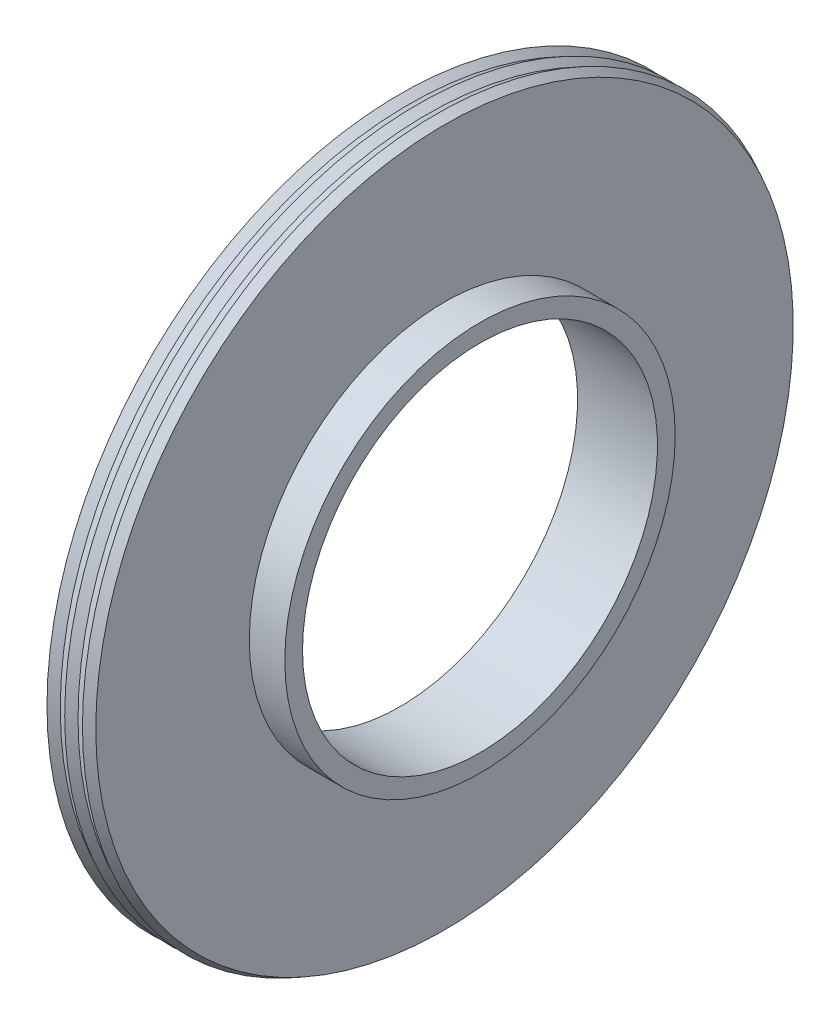
ISO-10303-21;
HEADER;
FILE_DESCRIPTION(('STEP AP214'),'2;1');
FILE_NAME('part.step','',(''),(''),'','','');
FILE_SCHEMA(('AUTOMOTIVE_DESIGN { 1 0 10303 214 1 1 1 1 }'));
ENDSEC;
DATA;
#1=APPLICATION_CONTEXT('core data for automotive mechanical design processes');
#2=APPLICATION_PROTOCOL_DEFINITION('international standard','automotive_design',2000,#1);
#3=PRODUCT_CONTEXT('',#1,'mechanical');
#4=PRODUCT('Part','Part','',(#3));
#5=PRODUCT_RELATED_PRODUCT_CATEGORY('part','',(#4));
#6=PRODUCT_DEFINITION_FORMATION('','',#4);
#7=PRODUCT_DEFINITION_CONTEXT('part definition',#1,'design');
#8=PRODUCT_DEFINITION('design','',#6,#7);
#9=PRODUCT_DEFINITION_SHAPE('','',#8);
#10=(LENGTH_UNIT() NAMED_UNIT(*) SI_UNIT(.MILLI.,.METRE.));
#11=(NAMED_UNIT(*) PLANE_ANGLE_UNIT() SI_UNIT($,.RADIAN.));
#12=(NAMED_UNIT(*) SI_UNIT($,.STERADIAN.) SOLID_ANGLE_UNIT());
#13=UNCERTAINTY_MEASURE_WITH_UNIT(LENGTH_MEASURE(1.E-05),#10,'distance_accuracy_value','');
#14=(GEOMETRIC_REPRESENTATION_CONTEXT(3) GLOBAL_UNCERTAINTY_ASSIGNED_CONTEXT((#13)) GLOBAL_UNIT_ASSIGNED_CONTEXT((#10,
#11,#12)) REPRESENTATION_CONTEXT('',''));
#15=CARTESIAN_POINT('',(0.,0.,0.));
#16=DIRECTION('',(0.,0.,1.));
#17=DIRECTION('',(1.,0.,0.));
#18=AXIS2_PLACEMENT_3D('',#15,#16,#17);
#19=CARTESIAN_POINT('',(2.00000000000001,0.,0.));
#20=DIRECTION('',(-1.,0.,0.));
#21=DIRECTION('',(0.,0.,1.));
#22=AXIS2_PLACEMENT_3D('',#19,#20,#21);
#23=CONICAL_SURFACE('',#22,39.8,0.46364760900082);
#24=CARTESIAN_POINT('',(3.,0.,0.));
#25=DIRECTION('',(-1.,0.,0.));
#26=DIRECTION('',(0.,0.,1.));
#27=AXIS2_PLACEMENT_3D('',#24,#25,#26);
#28=CIRCLE('',#27,39.3);
#29=CARTESIAN_POINT('',(3.,0.,39.3));
#30=VERTEX_POINT('',#29);
#31=EDGE_CURVE('E47',#30,#30,#28,.T.);
#32=ORIENTED_EDGE('',*,*,#31,.T.);
#33=EDGE_LOOP('',(#32));
#34=FACE_BOUND('',#33,.T.);
#35=CARTESIAN_POINT('',(2.00000000000001,0.,0.));
#36=DIRECTION('',(-1.,0.,0.));
#37=DIRECTION('',(0.,0.,1.));
#38=AXIS2_PLACEMENT_3D('',#35,#36,#37);
#39=CIRCLE('',#38,39.8);
#40=CARTESIAN_POINT('',(2.00000000000001,0.,39.8));
#41=VERTEX_POINT('',#40);
#42=EDGE_CURVE('E53',#41,#41,#39,.T.);
#43=ORIENTED_EDGE('',*,*,#42,.F.);
#44=EDGE_LOOP('',(#43));
#45=FACE_BOUND('',#44,.T.);
#46=ADVANCED_FACE('F41',(#34,#45),#23,.T.);
#47=CARTESIAN_POINT('',(3.,0.,0.));
#48=DIRECTION('',(1.,0.,0.));
#49=DIRECTION('',(0.,0.,-1.));
#50=AXIS2_PLACEMENT_3D('',#47,#48,#49);
#51=CONICAL_SURFACE('',#50,39.3,0.463647609000812);
#52=CARTESIAN_POINT('',(4.00000000000002,0.,0.));
#53=DIRECTION('',(-1.,0.,0.));
#54=DIRECTION('',(0.,0.,1.));
#55=AXIS2_PLACEMENT_3D('',#52,#53,#54);
#56=CIRCLE('',#55,39.8);
#57=CARTESIAN_POINT('',(4.00000000000002,0.,39.8));
#58=VERTEX_POINT('',#57);
#59=EDGE_CURVE('E10',#58,#58,#56,.T.);
#60=ORIENTED_EDGE('',*,*,#59,.T.);
#61=EDGE_LOOP('',(#60));
#62=FACE_BOUND('',#61,.T.);
#63=ORIENTED_EDGE('',*,*,#31,.F.);
#64=EDGE_LOOP('',(#63));
#65=FACE_BOUND('',#64,.T.);
#66=ADVANCED_FACE('F86',(#62,#65),#51,.T.);
#67=CARTESIAN_POINT('',(4.00000000000002,0.,0.));
#68=DIRECTION('',(-1.,0.,0.));
#69=DIRECTION('',(0.,0.,1.));
#70=AXIS2_PLACEMENT_3D('',#67,#68,#69);
#71=CONICAL_SURFACE('',#70,39.8,0.463647609000817);
#72=CARTESIAN_POINT('',(5.,0.,0.));
#73=DIRECTION('',(-1.,0.,0.));
#74=DIRECTION('',(0.,0.,1.));
#75=AXIS2_PLACEMENT_3D('',#72,#73,#74);
#76=CIRCLE('',#75,39.3);
#77=CARTESIAN_POINT('',(5.,0.,39.3));
#78=VERTEX_POINT('',#77);
#79=EDGE_CURVE('E61',#78,#78,#76,.T.);
#80=ORIENTED_EDGE('',*,*,#79,.T.);
#81=EDGE_LOOP('',(#80));
#82=FACE_BOUND('',#81,.T.);
#83=ORIENTED_EDGE('',*,*,#59,.F.);
#84=EDGE_LOOP('',(#83));
#85=FACE_BOUND('',#84,.T.);
#86=ADVANCED_FACE('F94',(#82,#85),#71,.T.);
#87=CARTESIAN_POINT('',(5.,0.,0.));
#88=DIRECTION('',(1.,0.,0.));
#89=DIRECTION('',(0.,0.,-1.));
#90=AXIS2_PLACEMENT_3D('',#87,#88,#89);
#91=PLANE('',#90);
#92=CARTESIAN_POINT('',(5.,0.,0.));
#93=DIRECTION('',(-1.,0.,0.));
#94=DIRECTION('',(0.,0.,1.));
#95=AXIS2_PLACEMENT_3D('',#92,#93,#94);
#96=CIRCLE('',#95,22.);
#97=CARTESIAN_POINT('',(5.,0.,22.));
#98=VERTEX_POINT('',#97);
#99=EDGE_CURVE('E68',#98,#98,#96,.T.);
#100=ORIENTED_EDGE('',*,*,#99,.T.);
#101=EDGE_LOOP('',(#100));
#102=FACE_BOUND('',#101,.T.);
#103=ORIENTED_EDGE('',*,*,#79,.F.);
#104=EDGE_LOOP('',(#103));
#105=FACE_BOUND('',#104,.T.);
#106=ADVANCED_FACE('F101',(#102,#105),#91,.T.);
#107=CARTESIAN_POINT('',(1.,0.,0.));
#108=DIRECTION('',(1.,0.,0.));
#109=DIRECTION('',(0.,0.,-1.));
#110=AXIS2_PLACEMENT_3D('',#107,#108,#109);
#111=CONICAL_SURFACE('',#110,39.3,0.463647609000809);
#112=ORIENTED_EDGE('',*,*,#42,.T.);
#113=EDGE_LOOP('',(#112));
#114=FACE_BOUND('',#113,.T.);
#115=CARTESIAN_POINT('',(1.,0.,0.));
#116=DIRECTION('',(-1.,0.,0.));
#117=DIRECTION('',(0.,0.,1.));
#118=AXIS2_PLACEMENT_3D('',#115,#116,#117);
#119=CIRCLE('',#118,39.3);
#120=CARTESIAN_POINT('',(1.,0.,39.3));
#121=VERTEX_POINT('',#120);
#122=EDGE_CURVE('E80',#121,#121,#119,.T.);
#123=ORIENTED_EDGE('',*,*,#122,.F.);
#124=EDGE_LOOP('',(#123));
#125=FACE_BOUND('',#124,.T.);
#126=ADVANCED_FACE('F83',(#114,#125),#111,.T.);
#127=CARTESIAN_POINT('',(0.,0.,0.));
#128=DIRECTION('',(-1.,0.,0.));
#129=DIRECTION('',(0.,0.,1.));
#130=AXIS2_PLACEMENT_3D('',#127,#128,#129);
#131=CONICAL_SURFACE('',#130,39.8,0.463647609000806);
#132=ORIENTED_EDGE('',*,*,#122,.T.);
#133=EDGE_LOOP('',(#132));
#134=FACE_BOUND('',#133,.T.);
#135=CARTESIAN_POINT('',(0.,0.,0.));
#136=DIRECTION('',(-1.,0.,0.));
#137=DIRECTION('',(0.,0.,1.));
#138=AXIS2_PLACEMENT_3D('',#135,#136,#137);
#139=CIRCLE('',#138,39.8);
#140=CARTESIAN_POINT('',(0.,0.,39.8));
#141=VERTEX_POINT('',#140);
#142=EDGE_CURVE('E74',#141,#141,#139,.T.);
#143=ORIENTED_EDGE('',*,*,#142,.F.);
#144=EDGE_LOOP('',(#143));
#145=FACE_BOUND('',#144,.T.);
#146=ADVANCED_FACE('F117',(#134,#145),#131,.T.);
#147=CARTESIAN_POINT('',(0.,0.,0.));
#148=DIRECTION('',(-1.,0.,0.));
#149=DIRECTION('',(0.,0.,1.));
#150=AXIS2_PLACEMENT_3D('',#147,#148,#149);
#151=PLANE('',#150);
#152=ORIENTED_EDGE('',*,*,#142,.T.);
#153=EDGE_LOOP('',(#152));
#154=FACE_BOUND('',#153,.T.);
#155=CARTESIAN_POINT('',(0.,0.,0.));
#156=DIRECTION('',(-1.,0.,0.));
#157=DIRECTION('',(0.,0.,1.));
#158=AXIS2_PLACEMENT_3D('',#155,#156,#157);
#159=CIRCLE('',#158,20.);
#160=CARTESIAN_POINT('',(0.,0.,20.));
#161=VERTEX_POINT('',#160);
#162=EDGE_CURVE('E44',#161,#161,#159,.T.);
#163=ORIENTED_EDGE('',*,*,#162,.F.);
#164=EDGE_LOOP('',(#163));
#165=FACE_BOUND('',#164,.T.);
#166=ADVANCED_FACE('F112',(#154,#165),#151,.T.);
#167=CARTESIAN_POINT('',(-51.8776157449498,0.,0.));
#168=DIRECTION('',(-1.,0.,0.));
#169=DIRECTION('',(0.,0.,1.));
#170=AXIS2_PLACEMENT_3D('',#167,#168,#169);
#171=CYLINDRICAL_SURFACE('',#170,20.);
#172=CARTESIAN_POINT('',(9.,0.,0.));
#173=DIRECTION('',(-1.,0.,0.));
#174=DIRECTION('',(0.,0.,1.));
#175=AXIS2_PLACEMENT_3D('',#172,#173,#174);
#176=CIRCLE('',#175,20.);
#177=CARTESIAN_POINT('',(9.,0.,20.));
#178=VERTEX_POINT('',#177);
#179=EDGE_CURVE('E58',#178,#178,#176,.T.);
#180=ORIENTED_EDGE('',*,*,#179,.F.);
#181=EDGE_LOOP('',(#180));
#182=FACE_BOUND('',#181,.T.);
#183=ORIENTED_EDGE('',*,*,#162,.T.);
#184=EDGE_LOOP('',(#183));
#185=FACE_BOUND('',#184,.T.);
#186=ADVANCED_FACE('F43',(#182,#185),#171,.F.);
#187=CARTESIAN_POINT('',(9.,20.,0.));
#188=DIRECTION('',(-1.,0.,0.));
#189=DIRECTION('',(0.,0.,1.));
#190=AXIS2_PLACEMENT_3D('',#187,#188,#189);
#191=PLANE('',#190);
#192=CARTESIAN_POINT('',(9.,0.,0.));
#193=DIRECTION('',(-1.,0.,0.));
#194=DIRECTION('',(0.,0.,1.));
#195=AXIS2_PLACEMENT_3D('',#192,#193,#194);
#196=CIRCLE('',#195,22.);
#197=CARTESIAN_POINT('',(9.,0.,22.));
#198=VERTEX_POINT('',#197);
#199=EDGE_CURVE('E59',#198,#198,#196,.T.);
#200=ORIENTED_EDGE('',*,*,#199,.F.);
#201=EDGE_LOOP('',(#200));
#202=FACE_BOUND('',#201,.T.);
#203=ORIENTED_EDGE('',*,*,#179,.T.);
#204=EDGE_LOOP('',(#203));
#205=FACE_BOUND('',#204,.T.);
#206=ADVANCED_FACE('F102',(#202,#205),#191,.F.);
#207=CARTESIAN_POINT('',(-51.8776157449498,0.,0.));
#208=DIRECTION('',(-1.,0.,0.));
#209=DIRECTION('',(0.,0.,1.));
#210=AXIS2_PLACEMENT_3D('',#207,#208,#209);
#211=CYLINDRICAL_SURFACE('',#210,22.);
#212=ORIENTED_EDGE('',*,*,#99,.F.);
#213=EDGE_LOOP('',(#212));
#214=FACE_BOUND('',#213,.T.);
#215=ORIENTED_EDGE('',*,*,#199,.T.);
#216=EDGE_LOOP('',(#215));
#217=FACE_BOUND('',#216,.T.);
#218=ADVANCED_FACE('F105',(#214,#217),#211,.T.);
#219=CLOSED_SHELL('',(#46,#66,#86,#106,#126,#146,#166,#186,#206,#218));
#220=MANIFOLD_SOLID_BREP('B2',#219);
#221=ADVANCED_BREP_SHAPE_REPRESENTATION('',(#18,#220),#14);
#222=SHAPE_DEFINITION_REPRESENTATION(#9,#221);
ENDSEC;
END-ISO-10303-21;
